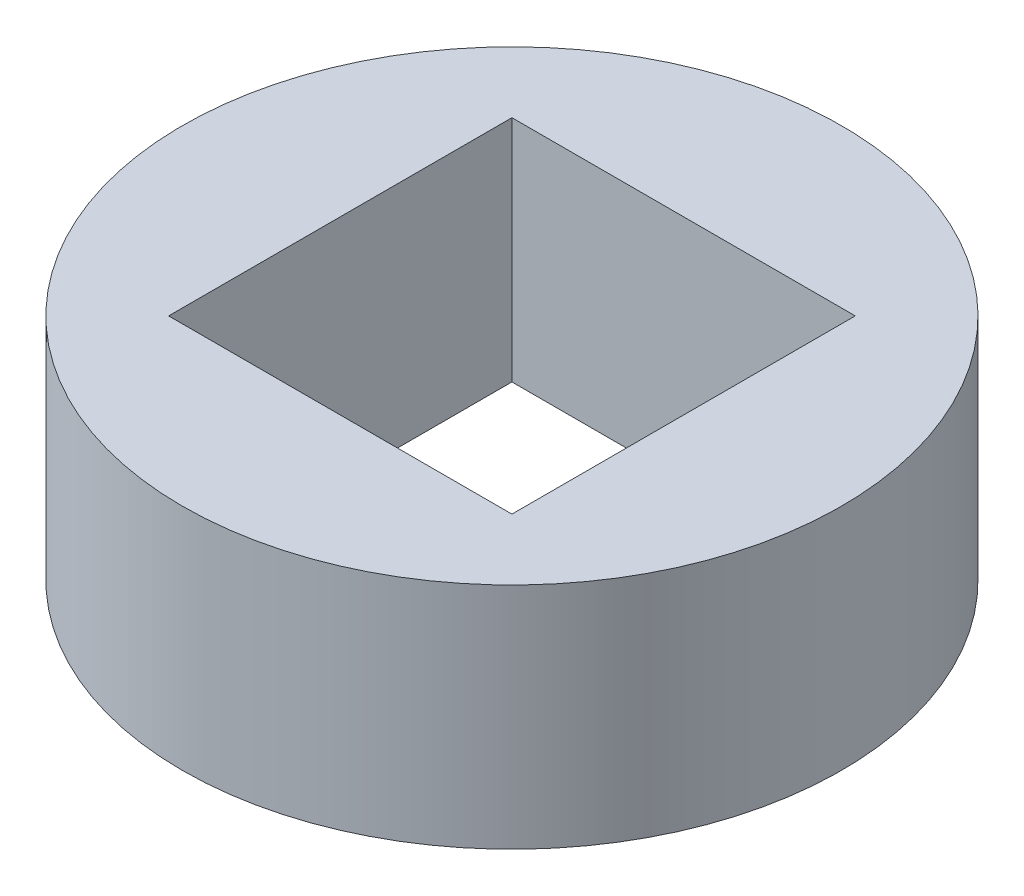
ISO-10303-21;
HEADER;
FILE_DESCRIPTION(('STEP AP214'),'2;1');
FILE_NAME('part.step','',(''),(''),'','','');
FILE_SCHEMA(('AUTOMOTIVE_DESIGN { 1 0 10303 214 1 1 1 1 }'));
ENDSEC;
DATA;
#1=APPLICATION_CONTEXT('core data for automotive mechanical design processes');
#2=APPLICATION_PROTOCOL_DEFINITION('international standard','automotive_design',2000,#1);
#3=PRODUCT_CONTEXT('',#1,'mechanical');
#4=PRODUCT('Part','Part','',(#3));
#5=PRODUCT_RELATED_PRODUCT_CATEGORY('part','',(#4));
#6=PRODUCT_DEFINITION_FORMATION('','',#4);
#7=PRODUCT_DEFINITION_CONTEXT('part definition',#1,'design');
#8=PRODUCT_DEFINITION('design','',#6,#7);
#9=PRODUCT_DEFINITION_SHAPE('','',#8);
#10=(LENGTH_UNIT() NAMED_UNIT(*) SI_UNIT(.MILLI.,.METRE.));
#11=(NAMED_UNIT(*) PLANE_ANGLE_UNIT() SI_UNIT($,.RADIAN.));
#12=(NAMED_UNIT(*) SI_UNIT($,.STERADIAN.) SOLID_ANGLE_UNIT());
#13=UNCERTAINTY_MEASURE_WITH_UNIT(LENGTH_MEASURE(1.E-05),#10,'distance_accuracy_value','');
#14=(GEOMETRIC_REPRESENTATION_CONTEXT(3) GLOBAL_UNCERTAINTY_ASSIGNED_CONTEXT((#13)) GLOBAL_UNIT_ASSIGNED_CONTEXT((#10,
#11,#12)) REPRESENTATION_CONTEXT('',''));
#15=CARTESIAN_POINT('',(0.,0.,0.));
#16=DIRECTION('',(0.,0.,1.));
#17=DIRECTION('',(1.,0.,0.));
#18=AXIS2_PLACEMENT_3D('',#15,#16,#17);
#19=CARTESIAN_POINT('',(0.,6.35,0.));
#20=DIRECTION('',(0.,1.,0.));
#21=DIRECTION('',(0.,0.,1.));
#22=AXIS2_PLACEMENT_3D('',#19,#20,#21);
#23=PLANE('',#22);
#24=CARTESIAN_POINT('',(0.,6.35,0.));
#25=DIRECTION('',(0.,1.,0.));
#26=DIRECTION('',(0.,0.,1.));
#27=AXIS2_PLACEMENT_3D('',#24,#25,#26);
#28=CIRCLE('',#27,9.144);
#29=CARTESIAN_POINT('',(0.,6.35,9.144));
#30=VERTEX_POINT('',#29);
#31=EDGE_CURVE('E11',#30,#30,#28,.T.);
#32=ORIENTED_EDGE('',*,*,#31,.T.);
#33=EDGE_LOOP('',(#32));
#34=FACE_BOUND('',#33,.T.);
#35=DIRECTION('',(-1.,0.,0.));
#36=VECTOR('',#35,1.);
#37=CARTESIAN_POINT('',(-4.76249999999999,6.35,-4.7625));
#38=LINE('',#37,#36);
#39=CARTESIAN_POINT('',(4.76250000000002,6.35,-4.7625));
#40=VERTEX_POINT('',#39);
#41=CARTESIAN_POINT('',(-4.76249999999999,6.35,-4.7625));
#42=VERTEX_POINT('',#41);
#43=EDGE_CURVE('E81',#40,#42,#38,.T.);
#44=ORIENTED_EDGE('',*,*,#43,.F.);
#45=DIRECTION('',(0.,0.,-1.));
#46=VECTOR('',#45,1.);
#47=CARTESIAN_POINT('',(4.76250000000002,6.35,4.7625));
#48=LINE('',#47,#46);
#49=CARTESIAN_POINT('',(4.76250000000002,6.35,4.7625));
#50=VERTEX_POINT('',#49);
#51=EDGE_CURVE('E73',#50,#40,#48,.T.);
#52=ORIENTED_EDGE('',*,*,#51,.F.);
#53=DIRECTION('',(1.,0.,0.));
#54=VECTOR('',#53,1.);
#55=CARTESIAN_POINT('',(-4.76249999999999,6.35,4.7625));
#56=LINE('',#55,#54);
#57=CARTESIAN_POINT('',(-4.76249999999999,6.35,4.7625));
#58=VERTEX_POINT('',#57);
#59=EDGE_CURVE('E94',#58,#50,#56,.T.);
#60=ORIENTED_EDGE('',*,*,#59,.F.);
#61=DIRECTION('',(0.,0.,1.));
#62=VECTOR('',#61,1.);
#63=CARTESIAN_POINT('',(-4.76249999999999,6.35,4.7625));
#64=LINE('',#63,#62);
#65=EDGE_CURVE('E92',#42,#58,#64,.T.);
#66=ORIENTED_EDGE('',*,*,#65,.F.);
#67=EDGE_LOOP('',(#44,#52,#60,#66));
#68=FACE_BOUND('',#67,.T.);
#69=ADVANCED_FACE('F32',(#34,#68),#23,.T.);
#70=CARTESIAN_POINT('',(0.,0.,0.));
#71=DIRECTION('',(0.,1.,0.));
#72=DIRECTION('',(0.,0.,1.));
#73=AXIS2_PLACEMENT_3D('',#70,#71,#72);
#74=PLANE('',#73);
#75=CARTESIAN_POINT('',(0.,0.,0.));
#76=DIRECTION('',(0.,1.,0.));
#77=DIRECTION('',(0.,0.,1.));
#78=AXIS2_PLACEMENT_3D('',#75,#76,#77);
#79=CIRCLE('',#78,9.144);
#80=CARTESIAN_POINT('',(0.,0.,9.144));
#81=VERTEX_POINT('',#80);
#82=EDGE_CURVE('E36',#81,#81,#79,.T.);
#83=ORIENTED_EDGE('',*,*,#82,.F.);
#84=EDGE_LOOP('',(#83));
#85=FACE_BOUND('',#84,.T.);
#86=DIRECTION('',(0.,0.,-1.));
#87=VECTOR('',#86,1.);
#88=CARTESIAN_POINT('',(4.76250000000002,0.,4.7625));
#89=LINE('',#88,#87);
#90=CARTESIAN_POINT('',(4.76250000000002,0.,4.7625));
#91=VERTEX_POINT('',#90);
#92=CARTESIAN_POINT('',(4.76250000000002,0.,-4.7625));
#93=VERTEX_POINT('',#92);
#94=EDGE_CURVE('E55',#91,#93,#89,.T.);
#95=ORIENTED_EDGE('',*,*,#94,.T.);
#96=DIRECTION('',(-1.,0.,0.));
#97=VECTOR('',#96,1.);
#98=CARTESIAN_POINT('',(-4.76249999999999,0.,-4.7625));
#99=LINE('',#98,#97);
#100=CARTESIAN_POINT('',(-4.76249999999999,0.,-4.7625));
#101=VERTEX_POINT('',#100);
#102=EDGE_CURVE('E88',#93,#101,#99,.T.);
#103=ORIENTED_EDGE('',*,*,#102,.T.);
#104=DIRECTION('',(0.,0.,1.));
#105=VECTOR('',#104,1.);
#106=CARTESIAN_POINT('',(-4.76249999999999,0.,4.7625));
#107=LINE('',#106,#105);
#108=CARTESIAN_POINT('',(-4.76249999999999,0.,4.7625));
#109=VERTEX_POINT('',#108);
#110=EDGE_CURVE('E100',#101,#109,#107,.T.);
#111=ORIENTED_EDGE('',*,*,#110,.T.);
#112=DIRECTION('',(1.,0.,0.));
#113=VECTOR('',#112,1.);
#114=CARTESIAN_POINT('',(-4.76249999999999,0.,4.7625));
#115=LINE('',#114,#113);
#116=EDGE_CURVE('E82',#109,#91,#115,.T.);
#117=ORIENTED_EDGE('',*,*,#116,.T.);
#118=EDGE_LOOP('',(#95,#103,#111,#117));
#119=FACE_BOUND('',#118,.T.);
#120=ADVANCED_FACE('F111',(#85,#119),#74,.F.);
#121=CARTESIAN_POINT('',(0.,6.35,0.));
#122=DIRECTION('',(0.,-1.,0.));
#123=DIRECTION('',(0.,0.,-1.));
#124=AXIS2_PLACEMENT_3D('',#121,#122,#123);
#125=CYLINDRICAL_SURFACE('',#124,9.144);
#126=ORIENTED_EDGE('',*,*,#31,.F.);
#127=EDGE_LOOP('',(#126));
#128=FACE_BOUND('',#127,.T.);
#129=ORIENTED_EDGE('',*,*,#82,.T.);
#130=EDGE_LOOP('',(#129));
#131=FACE_BOUND('',#130,.T.);
#132=ADVANCED_FACE('F34',(#128,#131),#125,.T.);
#133=CARTESIAN_POINT('',(4.76250000000002,6.35,4.7625));
#134=DIRECTION('',(-1.,0.,0.));
#135=DIRECTION('',(0.,0.,1.));
#136=AXIS2_PLACEMENT_3D('',#133,#134,#135);
#137=PLANE('',#136);
#138=ORIENTED_EDGE('',*,*,#94,.F.);
#139=DIRECTION('',(0.,-1.,0.));
#140=VECTOR('',#139,1.);
#141=CARTESIAN_POINT('',(4.76250000000002,6.35,4.7625));
#142=LINE('',#141,#140);
#143=EDGE_CURVE('E77',#50,#91,#142,.T.);
#144=ORIENTED_EDGE('',*,*,#143,.F.);
#145=ORIENTED_EDGE('',*,*,#51,.T.);
#146=DIRECTION('',(0.,-1.,0.));
#147=VECTOR('',#146,1.);
#148=CARTESIAN_POINT('',(4.76250000000002,6.35,-4.7625));
#149=LINE('',#148,#147);
#150=EDGE_CURVE('E76',#40,#93,#149,.T.);
#151=ORIENTED_EDGE('',*,*,#150,.T.);
#152=EDGE_LOOP('',(#138,#144,#145,#151));
#153=FACE_BOUND('',#152,.T.);
#154=ADVANCED_FACE('F75',(#153),#137,.T.);
#155=CARTESIAN_POINT('',(-4.76249999999999,6.35,-4.7625));
#156=DIRECTION('',(0.,0.,1.));
#157=DIRECTION('',(1.,0.,0.));
#158=AXIS2_PLACEMENT_3D('',#155,#156,#157);
#159=PLANE('',#158);
#160=ORIENTED_EDGE('',*,*,#102,.F.);
#161=ORIENTED_EDGE('',*,*,#150,.F.);
#162=ORIENTED_EDGE('',*,*,#43,.T.);
#163=DIRECTION('',(0.,-1.,0.));
#164=VECTOR('',#163,1.);
#165=CARTESIAN_POINT('',(-4.76249999999999,6.35,-4.7625));
#166=LINE('',#165,#164);
#167=EDGE_CURVE('E89',#42,#101,#166,.T.);
#168=ORIENTED_EDGE('',*,*,#167,.T.);
#169=EDGE_LOOP('',(#160,#161,#162,#168));
#170=FACE_BOUND('',#169,.T.);
#171=ADVANCED_FACE('F85',(#170),#159,.T.);
#172=CARTESIAN_POINT('',(-4.76249999999999,6.35,4.7625));
#173=DIRECTION('',(1.,0.,0.));
#174=DIRECTION('',(0.,0.,-1.));
#175=AXIS2_PLACEMENT_3D('',#172,#173,#174);
#176=PLANE('',#175);
#177=ORIENTED_EDGE('',*,*,#110,.F.);
#178=ORIENTED_EDGE('',*,*,#167,.F.);
#179=ORIENTED_EDGE('',*,*,#65,.T.);
#180=DIRECTION('',(0.,-1.,0.));
#181=VECTOR('',#180,1.);
#182=CARTESIAN_POINT('',(-4.76249999999999,6.35,4.7625));
#183=LINE('',#182,#181);
#184=EDGE_CURVE('E47',#58,#109,#183,.T.);
#185=ORIENTED_EDGE('',*,*,#184,.T.);
#186=EDGE_LOOP('',(#177,#178,#179,#185));
#187=FACE_BOUND('',#186,.T.);
#188=ADVANCED_FACE('F109',(#187),#176,.T.);
#189=CARTESIAN_POINT('',(-4.76249999999999,6.35,4.7625));
#190=DIRECTION('',(0.,0.,-1.));
#191=DIRECTION('',(-1.,0.,0.));
#192=AXIS2_PLACEMENT_3D('',#189,#190,#191);
#193=PLANE('',#192);
#194=ORIENTED_EDGE('',*,*,#116,.F.);
#195=ORIENTED_EDGE('',*,*,#184,.F.);
#196=ORIENTED_EDGE('',*,*,#59,.T.);
#197=ORIENTED_EDGE('',*,*,#143,.T.);
#198=EDGE_LOOP('',(#194,#195,#196,#197));
#199=FACE_BOUND('',#198,.T.);
#200=ADVANCED_FACE('F112',(#199),#193,.T.);
#201=CLOSED_SHELL('',(#69,#120,#132,#154,#171,#188,#200));
#202=MANIFOLD_SOLID_BREP('B2',#201);
#203=ADVANCED_BREP_SHAPE_REPRESENTATION('',(#18,#202),#14);
#204=SHAPE_DEFINITION_REPRESENTATION(#9,#203);
ENDSEC;
END-ISO-10303-21;
